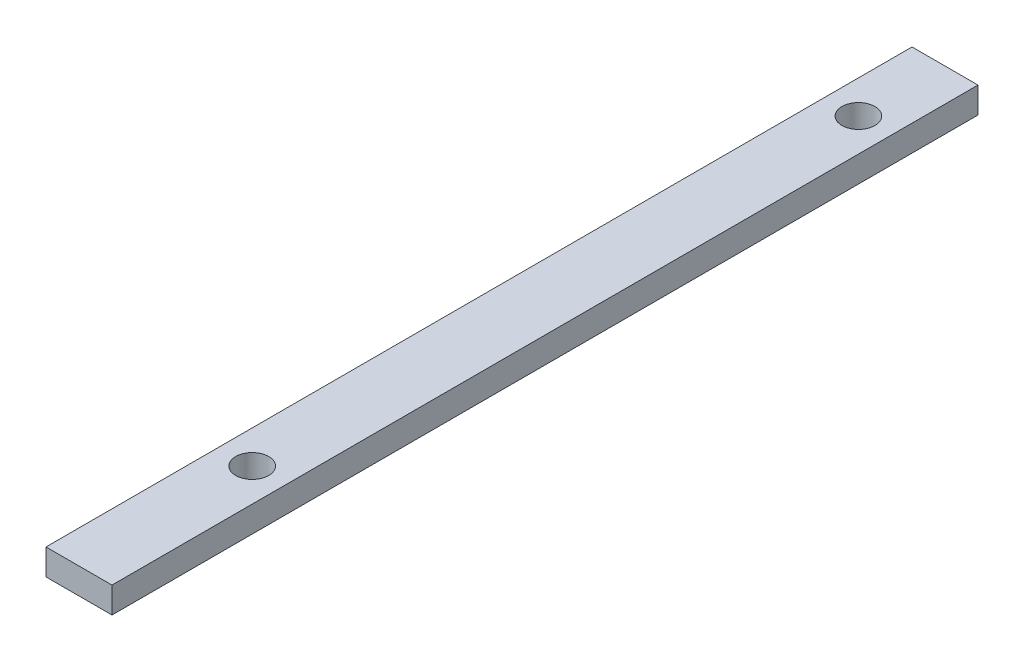
ISO-10303-21;
HEADER;
FILE_DESCRIPTION(('STEP AP214'),'2;1');
FILE_NAME('part.step','',(''),(''),'','','');
FILE_SCHEMA(('AUTOMOTIVE_DESIGN { 1 0 10303 214 1 1 1 1 }'));
ENDSEC;
DATA;
#1=APPLICATION_CONTEXT('core data for automotive mechanical design processes');
#2=APPLICATION_PROTOCOL_DEFINITION('international standard','automotive_design',2000,#1);
#3=PRODUCT_CONTEXT('',#1,'mechanical');
#4=PRODUCT('Part','Part','',(#3));
#5=PRODUCT_RELATED_PRODUCT_CATEGORY('part','',(#4));
#6=PRODUCT_DEFINITION_FORMATION('','',#4);
#7=PRODUCT_DEFINITION_CONTEXT('part definition',#1,'design');
#8=PRODUCT_DEFINITION('design','',#6,#7);
#9=PRODUCT_DEFINITION_SHAPE('','',#8);
#10=(LENGTH_UNIT() NAMED_UNIT(*) SI_UNIT(.MILLI.,.METRE.));
#11=(NAMED_UNIT(*) PLANE_ANGLE_UNIT() SI_UNIT($,.RADIAN.));
#12=(NAMED_UNIT(*) SI_UNIT($,.STERADIAN.) SOLID_ANGLE_UNIT());
#13=UNCERTAINTY_MEASURE_WITH_UNIT(LENGTH_MEASURE(1.E-05),#10,'distance_accuracy_value','');
#14=(GEOMETRIC_REPRESENTATION_CONTEXT(3) GLOBAL_UNCERTAINTY_ASSIGNED_CONTEXT((#13)) GLOBAL_UNIT_ASSIGNED_CONTEXT((#10,
#11,#12)) REPRESENTATION_CONTEXT('',''));
#15=CARTESIAN_POINT('',(0.,0.,0.));
#16=DIRECTION('',(0.,0.,1.));
#17=DIRECTION('',(1.,0.,0.));
#18=AXIS2_PLACEMENT_3D('',#15,#16,#17);
#19=CARTESIAN_POINT('',(0.,3.,0.));
#20=DIRECTION('',(1.,0.,0.));
#21=DIRECTION('',(0.,0.,-1.));
#22=AXIS2_PLACEMENT_3D('',#19,#20,#21);
#23=PLANE('',#22);
#24=DIRECTION('',(0.,0.,1.));
#25=VECTOR('',#24,1.);
#26=CARTESIAN_POINT('',(0.,0.,0.));
#27=LINE('',#26,#25);
#28=CARTESIAN_POINT('',(0.,0.,-100.));
#29=VERTEX_POINT('',#28);
#30=CARTESIAN_POINT('',(0.,0.,0.));
#31=VERTEX_POINT('',#30);
#32=EDGE_CURVE('E98',#29,#31,#27,.T.);
#33=ORIENTED_EDGE('',*,*,#32,.T.);
#34=DIRECTION('',(0.,-1.,0.));
#35=VECTOR('',#34,1.);
#36=CARTESIAN_POINT('',(0.,3.,0.));
#37=LINE('',#36,#35);
#38=CARTESIAN_POINT('',(0.,3.,0.));
#39=VERTEX_POINT('',#38);
#40=EDGE_CURVE('E11',#39,#31,#37,.T.);
#41=ORIENTED_EDGE('',*,*,#40,.F.);
#42=DIRECTION('',(0.,0.,1.));
#43=VECTOR('',#42,1.);
#44=CARTESIAN_POINT('',(0.,3.,0.));
#45=LINE('',#44,#43);
#46=CARTESIAN_POINT('',(0.,3.,-100.));
#47=VERTEX_POINT('',#46);
#48=EDGE_CURVE('E86',#47,#39,#45,.T.);
#49=ORIENTED_EDGE('',*,*,#48,.F.);
#50=DIRECTION('',(0.,-1.,0.));
#51=VECTOR('',#50,1.);
#52=CARTESIAN_POINT('',(0.,3.,-100.));
#53=LINE('',#52,#51);
#54=EDGE_CURVE('E94',#47,#29,#53,.T.);
#55=ORIENTED_EDGE('',*,*,#54,.T.);
#56=EDGE_LOOP('',(#33,#41,#49,#55));
#57=FACE_BOUND('',#56,.T.);
#58=ADVANCED_FACE('F35',(#57),#23,.F.);
#59=CARTESIAN_POINT('',(0.,3.,0.));
#60=DIRECTION('',(0.,0.,-1.));
#61=DIRECTION('',(-1.,0.,0.));
#62=AXIS2_PLACEMENT_3D('',#59,#60,#61);
#63=PLANE('',#62);
#64=DIRECTION('',(1.,0.,0.));
#65=VECTOR('',#64,1.);
#66=CARTESIAN_POINT('',(0.,0.,0.));
#67=LINE('',#66,#65);
#68=CARTESIAN_POINT('',(7.62,0.,0.));
#69=VERTEX_POINT('',#68);
#70=EDGE_CURVE('E90',#31,#69,#67,.T.);
#71=ORIENTED_EDGE('',*,*,#70,.T.);
#72=DIRECTION('',(0.,-1.,0.));
#73=VECTOR('',#72,1.);
#74=CARTESIAN_POINT('',(7.62,3.,0.));
#75=LINE('',#74,#73);
#76=CARTESIAN_POINT('',(7.62,3.,0.));
#77=VERTEX_POINT('',#76);
#78=EDGE_CURVE('E43',#77,#69,#75,.T.);
#79=ORIENTED_EDGE('',*,*,#78,.F.);
#80=DIRECTION('',(1.,0.,0.));
#81=VECTOR('',#80,1.);
#82=CARTESIAN_POINT('',(0.,3.,0.));
#83=LINE('',#82,#81);
#84=EDGE_CURVE('E81',#39,#77,#83,.T.);
#85=ORIENTED_EDGE('',*,*,#84,.F.);
#86=ORIENTED_EDGE('',*,*,#40,.T.);
#87=EDGE_LOOP('',(#71,#79,#85,#86));
#88=FACE_BOUND('',#87,.T.);
#89=ADVANCED_FACE('F89',(#88),#63,.F.);
#90=CARTESIAN_POINT('',(7.62,3.,0.));
#91=DIRECTION('',(-1.,0.,0.));
#92=DIRECTION('',(0.,0.,1.));
#93=AXIS2_PLACEMENT_3D('',#90,#91,#92);
#94=PLANE('',#93);
#95=DIRECTION('',(0.,0.,-1.));
#96=VECTOR('',#95,1.);
#97=CARTESIAN_POINT('',(7.62,0.,0.));
#98=LINE('',#97,#96);
#99=CARTESIAN_POINT('',(7.62,0.,-100.));
#100=VERTEX_POINT('',#99);
#101=EDGE_CURVE('E68',#69,#100,#98,.T.);
#102=ORIENTED_EDGE('',*,*,#101,.T.);
#103=DIRECTION('',(0.,-1.,0.));
#104=VECTOR('',#103,1.);
#105=CARTESIAN_POINT('',(7.62,3.,-100.));
#106=LINE('',#105,#104);
#107=CARTESIAN_POINT('',(7.62,3.,-100.));
#108=VERTEX_POINT('',#107);
#109=EDGE_CURVE('E91',#108,#100,#106,.T.);
#110=ORIENTED_EDGE('',*,*,#109,.F.);
#111=DIRECTION('',(0.,0.,-1.));
#112=VECTOR('',#111,1.);
#113=CARTESIAN_POINT('',(7.62,3.,0.));
#114=LINE('',#113,#112);
#115=EDGE_CURVE('E84',#77,#108,#114,.T.);
#116=ORIENTED_EDGE('',*,*,#115,.F.);
#117=ORIENTED_EDGE('',*,*,#78,.T.);
#118=EDGE_LOOP('',(#102,#110,#116,#117));
#119=FACE_BOUND('',#118,.T.);
#120=ADVANCED_FACE('F92',(#119),#94,.F.);
#121=CARTESIAN_POINT('',(0.,3.,-100.));
#122=DIRECTION('',(0.,0.,1.));
#123=DIRECTION('',(1.,0.,0.));
#124=AXIS2_PLACEMENT_3D('',#121,#122,#123);
#125=PLANE('',#124);
#126=DIRECTION('',(-1.,0.,0.));
#127=VECTOR('',#126,1.);
#128=CARTESIAN_POINT('',(0.,0.,-100.));
#129=LINE('',#128,#127);
#130=EDGE_CURVE('E74',#100,#29,#129,.T.);
#131=ORIENTED_EDGE('',*,*,#130,.T.);
#132=ORIENTED_EDGE('',*,*,#54,.F.);
#133=DIRECTION('',(-1.,0.,0.));
#134=VECTOR('',#133,1.);
#135=CARTESIAN_POINT('',(0.,3.,-100.));
#136=LINE('',#135,#134);
#137=EDGE_CURVE('E51',#108,#47,#136,.T.);
#138=ORIENTED_EDGE('',*,*,#137,.F.);
#139=ORIENTED_EDGE('',*,*,#109,.T.);
#140=EDGE_LOOP('',(#131,#132,#138,#139));
#141=FACE_BOUND('',#140,.T.);
#142=ADVANCED_FACE('F106',(#141),#125,.F.);
#143=CARTESIAN_POINT('',(0.,3.,0.));
#144=DIRECTION('',(0.,-1.,0.));
#145=DIRECTION('',(0.,0.,-1.));
#146=AXIS2_PLACEMENT_3D('',#143,#144,#145);
#147=PLANE('',#146);
#148=CARTESIAN_POINT('',(3.81000000000004,3.,-90.));
#149=DIRECTION('',(0.,1.,0.));
#150=DIRECTION('',(0.,0.,-1.));
#151=AXIS2_PLACEMENT_3D('',#148,#149,#150);
#152=CIRCLE('',#151,1.90499999999999);
#153=CARTESIAN_POINT('',(3.81000000000004,3.,-91.905));
#154=VERTEX_POINT('',#153);
#155=EDGE_CURVE('E118',#154,#154,#152,.T.);
#156=ORIENTED_EDGE('',*,*,#155,.F.);
#157=EDGE_LOOP('',(#156));
#158=FACE_BOUND('',#157,.T.);
#159=CARTESIAN_POINT('',(3.81000000000001,3.,-20.));
#160=DIRECTION('',(0.,1.,0.));
#161=DIRECTION('',(0.,0.,1.));
#162=AXIS2_PLACEMENT_3D('',#159,#160,#161);
#163=CIRCLE('',#162,1.905);
#164=CARTESIAN_POINT('',(3.81000000000001,3.,-18.095));
#165=VERTEX_POINT('',#164);
#166=EDGE_CURVE('E112',#165,#165,#163,.T.);
#167=ORIENTED_EDGE('',*,*,#166,.F.);
#168=EDGE_LOOP('',(#167));
#169=FACE_BOUND('',#168,.T.);
#170=ORIENTED_EDGE('',*,*,#48,.T.);
#171=ORIENTED_EDGE('',*,*,#84,.T.);
#172=ORIENTED_EDGE('',*,*,#115,.T.);
#173=ORIENTED_EDGE('',*,*,#137,.T.);
#174=EDGE_LOOP('',(#170,#171,#172,#173));
#175=FACE_BOUND('',#174,.T.);
#176=ADVANCED_FACE('F82',(#158,#169,#175),#147,.F.);
#177=CARTESIAN_POINT('',(0.,0.,0.));
#178=DIRECTION('',(0.,-1.,0.));
#179=DIRECTION('',(0.,0.,-1.));
#180=AXIS2_PLACEMENT_3D('',#177,#178,#179);
#181=PLANE('',#180);
#182=CARTESIAN_POINT('',(3.81000000000004,0.,-90.));
#183=DIRECTION('',(0.,1.,0.));
#184=DIRECTION('',(0.,0.,-1.));
#185=AXIS2_PLACEMENT_3D('',#182,#183,#184);
#186=CIRCLE('',#185,1.90499999999999);
#187=CARTESIAN_POINT('',(3.81000000000004,0.,-91.905));
#188=VERTEX_POINT('',#187);
#189=EDGE_CURVE('E101',#188,#188,#186,.T.);
#190=ORIENTED_EDGE('',*,*,#189,.T.);
#191=EDGE_LOOP('',(#190));
#192=FACE_BOUND('',#191,.T.);
#193=CARTESIAN_POINT('',(3.81000000000001,0.,-20.));
#194=DIRECTION('',(0.,1.,0.));
#195=DIRECTION('',(0.,0.,1.));
#196=AXIS2_PLACEMENT_3D('',#193,#194,#195);
#197=CIRCLE('',#196,1.905);
#198=CARTESIAN_POINT('',(3.81000000000001,0.,-18.095));
#199=VERTEX_POINT('',#198);
#200=EDGE_CURVE('E115',#199,#199,#197,.T.);
#201=ORIENTED_EDGE('',*,*,#200,.T.);
#202=EDGE_LOOP('',(#201));
#203=FACE_BOUND('',#202,.T.);
#204=ORIENTED_EDGE('',*,*,#32,.F.);
#205=ORIENTED_EDGE('',*,*,#130,.F.);
#206=ORIENTED_EDGE('',*,*,#101,.F.);
#207=ORIENTED_EDGE('',*,*,#70,.F.);
#208=EDGE_LOOP('',(#204,#205,#206,#207));
#209=FACE_BOUND('',#208,.T.);
#210=ADVANCED_FACE('F109',(#192,#203,#209),#181,.T.);
#211=CARTESIAN_POINT('',(3.81000000000001,0.,-20.));
#212=DIRECTION('',(0.,1.,0.));
#213=DIRECTION('',(0.,0.,1.));
#214=AXIS2_PLACEMENT_3D('',#211,#212,#213);
#215=CYLINDRICAL_SURFACE('',#214,1.905);
#216=ORIENTED_EDGE('',*,*,#200,.F.);
#217=EDGE_LOOP('',(#216));
#218=FACE_BOUND('',#217,.T.);
#219=ORIENTED_EDGE('',*,*,#166,.T.);
#220=EDGE_LOOP('',(#219));
#221=FACE_BOUND('',#220,.T.);
#222=ADVANCED_FACE('F129',(#218,#221),#215,.F.);
#223=CARTESIAN_POINT('',(3.81000000000004,0.,-90.));
#224=DIRECTION('',(0.,1.,0.));
#225=DIRECTION('',(0.,0.,1.));
#226=AXIS2_PLACEMENT_3D('',#223,#224,#225);
#227=CYLINDRICAL_SURFACE('',#226,1.90499999999999);
#228=ORIENTED_EDGE('',*,*,#189,.F.);
#229=EDGE_LOOP('',(#228));
#230=FACE_BOUND('',#229,.T.);
#231=ORIENTED_EDGE('',*,*,#155,.T.);
#232=EDGE_LOOP('',(#231));
#233=FACE_BOUND('',#232,.T.);
#234=ADVANCED_FACE('F126',(#230,#233),#227,.F.);
#235=CLOSED_SHELL('',(#58,#89,#120,#142,#176,#210,#222,#234));
#236=MANIFOLD_SOLID_BREP('B2',#235);
#237=ADVANCED_BREP_SHAPE_REPRESENTATION('',(#18,#236),#14);
#238=SHAPE_DEFINITION_REPRESENTATION(#9,#237);
ENDSEC;
END-ISO-10303-21;
